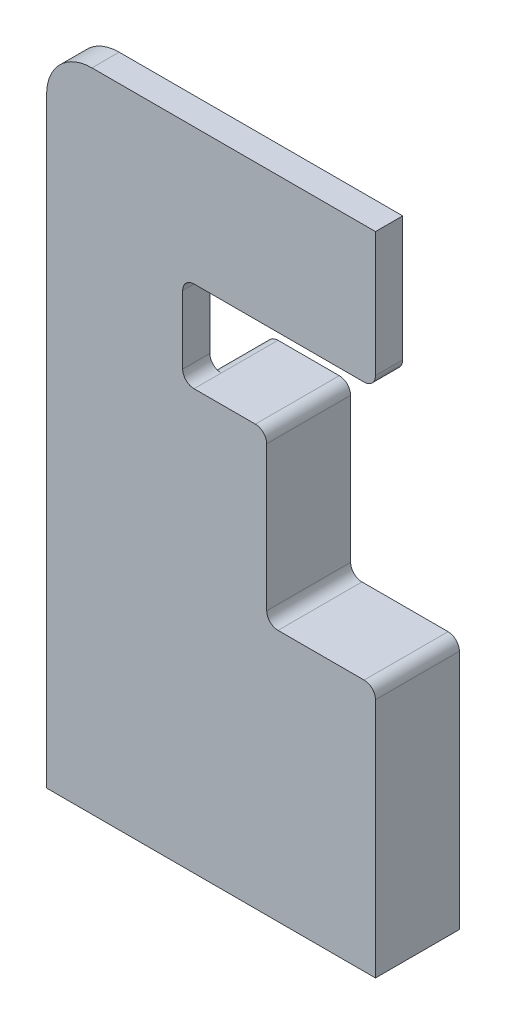
ISO-10303-21;
HEADER;
FILE_DESCRIPTION(('STEP AP214'),'2;1');
FILE_NAME('part.step','',(''),(''),'','','');
FILE_SCHEMA(('AUTOMOTIVE_DESIGN { 1 0 10303 214 1 1 1 1 }'));
ENDSEC;
DATA;
#1=APPLICATION_CONTEXT('core data for automotive mechanical design processes');
#2=APPLICATION_PROTOCOL_DEFINITION('international standard','automotive_design',2000,#1);
#3=PRODUCT_CONTEXT('',#1,'mechanical');
#4=PRODUCT('Part','Part','',(#3));
#5=PRODUCT_RELATED_PRODUCT_CATEGORY('part','',(#4));
#6=PRODUCT_DEFINITION_FORMATION('','',#4);
#7=PRODUCT_DEFINITION_CONTEXT('part definition',#1,'design');
#8=PRODUCT_DEFINITION('design','',#6,#7);
#9=PRODUCT_DEFINITION_SHAPE('','',#8);
#10=(LENGTH_UNIT() NAMED_UNIT(*) SI_UNIT(.MILLI.,.METRE.));
#11=(NAMED_UNIT(*) PLANE_ANGLE_UNIT() SI_UNIT($,.RADIAN.));
#12=(NAMED_UNIT(*) SI_UNIT($,.STERADIAN.) SOLID_ANGLE_UNIT());
#13=UNCERTAINTY_MEASURE_WITH_UNIT(LENGTH_MEASURE(1.E-05),#10,'distance_accuracy_value','');
#14=(GEOMETRIC_REPRESENTATION_CONTEXT(3) GLOBAL_UNCERTAINTY_ASSIGNED_CONTEXT((#13)) GLOBAL_UNIT_ASSIGNED_CONTEXT((#10,
#11,#12)) REPRESENTATION_CONTEXT('',''));
#15=CARTESIAN_POINT('',(0.,0.,0.));
#16=DIRECTION('',(0.,0.,1.));
#17=DIRECTION('',(1.,0.,0.));
#18=AXIS2_PLACEMENT_3D('',#15,#16,#17);
#19=CARTESIAN_POINT('',(-1.09167308680438,0.,12.));
#20=DIRECTION('',(1.,0.,0.));
#21=DIRECTION('',(0.,1.,0.));
#22=AXIS2_PLACEMENT_3D('',#19,#20,#21);
#23=PLANE('',#22);
#24=DIRECTION('',(0.,-1.,0.));
#25=VECTOR('',#24,1.);
#26=CARTESIAN_POINT('',(-1.09167308680438,0.,0.));
#27=LINE('',#26,#25);
#28=CARTESIAN_POINT('',(-1.09167308680438,13.5,0.));
#29=VERTEX_POINT('',#28);
#30=CARTESIAN_POINT('',(-1.09167308680438,0.749999999998386,0.));
#31=VERTEX_POINT('',#30);
#32=EDGE_CURVE('E317',#29,#31,#27,.T.);
#33=ORIENTED_EDGE('',*,*,#32,.F.);
#34=DIRECTION('',(0.,0.,-1.));
#35=VECTOR('',#34,1.);
#36=CARTESIAN_POINT('',(-1.09167308680438,13.5,12.));
#37=LINE('',#36,#35);
#38=CARTESIAN_POINT('',(-1.09167308680438,13.5,7.4));
#39=VERTEX_POINT('',#38);
#40=EDGE_CURVE('E230',#29,#39,#37,.F.);
#41=ORIENTED_EDGE('',*,*,#40,.T.);
#42=DIRECTION('',(0.,-1.,0.));
#43=VECTOR('',#42,1.);
#44=CARTESIAN_POINT('',(-1.09167308680438,0.,7.4));
#45=LINE('',#44,#43);
#46=CARTESIAN_POINT('',(-1.09167308680438,0.749999999998386,7.4));
#47=VERTEX_POINT('',#46);
#48=EDGE_CURVE('E326',#39,#47,#45,.T.);
#49=ORIENTED_EDGE('',*,*,#48,.T.);
#50=DIRECTION('',(0.,0.,-1.));
#51=VECTOR('',#50,1.);
#52=CARTESIAN_POINT('',(-1.09167308680438,0.749999999998386,12.));
#53=LINE('',#52,#51);
#54=EDGE_CURVE('E227',#47,#31,#53,.T.);
#55=ORIENTED_EDGE('',*,*,#54,.T.);
#56=EDGE_LOOP('',(#33,#41,#49,#55));
#57=FACE_BOUND('',#56,.T.);
#58=ADVANCED_FACE('F39',(#57),#23,.T.);
#59=CARTESIAN_POINT('',(0.,0.,0.));
#60=DIRECTION('',(0.,0.,1.));
#61=DIRECTION('',(1.,0.,0.));
#62=AXIS2_PLACEMENT_3D('',#59,#60,#61);
#63=PLANE('',#62);
#64=DIRECTION('',(1.,0.,0.));
#65=VECTOR('',#64,1.);
#66=CARTESIAN_POINT('',(-8.5,-22.5,0.));
#67=LINE('',#66,#65);
#68=CARTESIAN_POINT('',(-7.5,-22.5,0.));
#69=VERTEX_POINT('',#68);
#70=CARTESIAN_POINT('',(8.5,-22.5,0.));
#71=VERTEX_POINT('',#70);
#72=EDGE_CURVE('E205',#69,#71,#67,.T.);
#73=ORIENTED_EDGE('',*,*,#72,.F.);
#74=CARTESIAN_POINT('',(-7.5,-21.5,0.));
#75=DIRECTION('',(0.,0.,1.));
#76=DIRECTION('',(1.,0.,0.));
#77=AXIS2_PLACEMENT_3D('',#74,#75,#76);
#78=CIRCLE('',#77,1.);
#79=CARTESIAN_POINT('',(-8.5,-21.5,0.));
#80=VERTEX_POINT('',#79);
#81=EDGE_CURVE('E275',#69,#80,#78,.F.);
#82=ORIENTED_EDGE('',*,*,#81,.T.);
#83=DIRECTION('',(0.,-1.,0.));
#84=VECTOR('',#83,1.);
#85=CARTESIAN_POINT('',(-8.5,22.5,0.));
#86=LINE('',#85,#84);
#87=CARTESIAN_POINT('',(-8.5,13.5,0.));
#88=VERTEX_POINT('',#87);
#89=EDGE_CURVE('E211',#88,#80,#86,.T.);
#90=ORIENTED_EDGE('',*,*,#89,.F.);
#91=CARTESIAN_POINT('',(-7.5,13.5,0.));
#92=DIRECTION('',(0.,0.,1.));
#93=DIRECTION('',(1.,0.,0.));
#94=AXIS2_PLACEMENT_3D('',#91,#92,#93);
#95=CIRCLE('',#94,1.);
#96=CARTESIAN_POINT('',(-7.5,14.5,0.));
#97=VERTEX_POINT('',#96);
#98=EDGE_CURVE('E273',#88,#97,#95,.F.);
#99=ORIENTED_EDGE('',*,*,#98,.T.);
#100=DIRECTION('',(1.,0.,0.));
#101=VECTOR('',#100,1.);
#102=CARTESIAN_POINT('',(0.,14.5,0.));
#103=LINE('',#102,#101);
#104=CARTESIAN_POINT('',(-2.09167308680438,14.5,0.));
#105=VERTEX_POINT('',#104);
#106=EDGE_CURVE('E345',#97,#105,#103,.T.);
#107=ORIENTED_EDGE('',*,*,#106,.T.);
#108=CARTESIAN_POINT('',(-2.09167308680438,13.5,0.));
#109=DIRECTION('',(0.,0.,1.));
#110=DIRECTION('',(1.,0.,0.));
#111=AXIS2_PLACEMENT_3D('',#108,#109,#110);
#112=CIRCLE('',#111,1.);
#113=EDGE_CURVE('E225',#105,#29,#112,.F.);
#114=ORIENTED_EDGE('',*,*,#113,.T.);
#115=ORIENTED_EDGE('',*,*,#32,.T.);
#116=CARTESIAN_POINT('',(-0.0916730868043844,0.749999999998386,0.));
#117=DIRECTION('',(0.,0.,1.));
#118=DIRECTION('',(1.,0.,0.));
#119=AXIS2_PLACEMENT_3D('',#116,#117,#118);
#120=CIRCLE('',#119,1.);
#121=CARTESIAN_POINT('',(-0.0916730868043844,-0.250000000001614,0.));
#122=VERTEX_POINT('',#121);
#123=EDGE_CURVE('E259',#31,#122,#120,.T.);
#124=ORIENTED_EDGE('',*,*,#123,.T.);
#125=DIRECTION('',(-1.,0.,0.));
#126=VECTOR('',#125,1.);
#127=CARTESIAN_POINT('',(0.,-0.250000000001614,0.));
#128=LINE('',#127,#126);
#129=CARTESIAN_POINT('',(7.5,-0.250000000001614,0.));
#130=VERTEX_POINT('',#129);
#131=EDGE_CURVE('E320',#130,#122,#128,.T.);
#132=ORIENTED_EDGE('',*,*,#131,.F.);
#133=CARTESIAN_POINT('',(7.5,-1.25000000000161,0.));
#134=DIRECTION('',(0.,0.,1.));
#135=DIRECTION('',(1.,0.,0.));
#136=AXIS2_PLACEMENT_3D('',#133,#134,#135);
#137=CIRCLE('',#136,1.);
#138=CARTESIAN_POINT('',(8.5,-1.25000000000161,0.));
#139=VERTEX_POINT('',#138);
#140=EDGE_CURVE('E223',#130,#139,#137,.F.);
#141=ORIENTED_EDGE('',*,*,#140,.T.);
#142=DIRECTION('',(0.,1.,0.));
#143=VECTOR('',#142,1.);
#144=CARTESIAN_POINT('',(8.5,22.5,0.));
#145=LINE('',#144,#143);
#146=EDGE_CURVE('E296',#71,#139,#145,.T.);
#147=ORIENTED_EDGE('',*,*,#146,.F.);
#148=EDGE_LOOP('',(#73,#82,#90,#99,#107,#114,#115,#124,#132,#141,#147));
#149=FACE_BOUND('',#148,.T.);
#150=ADVANCED_FACE('F294',(#149),#63,.F.);
#151=CARTESIAN_POINT('',(-8.5,22.5,12.));
#152=DIRECTION('',(1.,0.,0.));
#153=DIRECTION('',(0.,1.,0.));
#154=AXIS2_PLACEMENT_3D('',#151,#152,#153);
#155=PLANE('',#154);
#156=ORIENTED_EDGE('',*,*,#89,.T.);
#157=DIRECTION('',(0.,0.,-1.));
#158=VECTOR('',#157,1.);
#159=CARTESIAN_POINT('',(-8.5,-21.5,12.));
#160=LINE('',#159,#158);
#161=CARTESIAN_POINT('',(-8.5,-21.5,5.));
#162=VERTEX_POINT('',#161);
#163=EDGE_CURVE('E59',#80,#162,#160,.F.);
#164=ORIENTED_EDGE('',*,*,#163,.T.);
#165=DIRECTION('',(0.,1.,0.));
#166=VECTOR('',#165,1.);
#167=CARTESIAN_POINT('',(-8.5,-22.5,5.));
#168=LINE('',#167,#166);
#169=CARTESIAN_POINT('',(-8.5,13.5,5.));
#170=VERTEX_POINT('',#169);
#171=EDGE_CURVE('E290',#162,#170,#168,.T.);
#172=ORIENTED_EDGE('',*,*,#171,.T.);
#173=DIRECTION('',(0.,0.,-1.));
#174=VECTOR('',#173,1.);
#175=CARTESIAN_POINT('',(-8.5,13.5,0.));
#176=LINE('',#175,#174);
#177=EDGE_CURVE('E277',#170,#88,#176,.T.);
#178=ORIENTED_EDGE('',*,*,#177,.T.);
#179=EDGE_LOOP('',(#156,#164,#172,#178));
#180=FACE_BOUND('',#179,.T.);
#181=ADVANCED_FACE('F390',(#180),#155,.F.);
#182=CARTESIAN_POINT('',(0.,0.,7.4));
#183=DIRECTION('',(0.,0.,1.));
#184=DIRECTION('',(1.,0.,0.));
#185=AXIS2_PLACEMENT_3D('',#182,#183,#184);
#186=PLANE('',#185);
#187=ORIENTED_EDGE('',*,*,#48,.F.);
#188=CARTESIAN_POINT('',(-2.09167308680438,13.5,7.4));
#189=DIRECTION('',(0.,0.,1.));
#190=DIRECTION('',(1.,0.,0.));
#191=AXIS2_PLACEMENT_3D('',#188,#189,#190);
#192=CIRCLE('',#191,1.);
#193=CARTESIAN_POINT('',(-2.09167308680438,14.5,7.4));
#194=VERTEX_POINT('',#193);
#195=EDGE_CURVE('E236',#39,#194,#192,.T.);
#196=ORIENTED_EDGE('',*,*,#195,.T.);
#197=DIRECTION('',(1.,0.,0.));
#198=VECTOR('',#197,1.);
#199=CARTESIAN_POINT('',(0.,14.5,7.4));
#200=LINE('',#199,#198);
#201=CARTESIAN_POINT('',(-7.5,14.5,7.4));
#202=VERTEX_POINT('',#201);
#203=EDGE_CURVE('E347',#202,#194,#200,.T.);
#204=ORIENTED_EDGE('',*,*,#203,.F.);
#205=CARTESIAN_POINT('',(-7.5,15.5,7.4));
#206=DIRECTION('',(0.,0.,1.));
#207=DIRECTION('',(1.,0.,0.));
#208=AXIS2_PLACEMENT_3D('',#205,#206,#207);
#209=CIRCLE('',#208,1.);
#210=CARTESIAN_POINT('',(-8.5,15.5,7.4));
#211=VERTEX_POINT('',#210);
#212=EDGE_CURVE('E269',#202,#211,#209,.F.);
#213=ORIENTED_EDGE('',*,*,#212,.T.);
#214=DIRECTION('',(0.,1.,0.));
#215=VECTOR('',#214,1.);
#216=CARTESIAN_POINT('',(-8.5,0.,7.4));
#217=LINE('',#216,#215);
#218=CARTESIAN_POINT('',(-8.5,21.5,7.4));
#219=VERTEX_POINT('',#218);
#220=EDGE_CURVE('E344',#211,#219,#217,.T.);
#221=ORIENTED_EDGE('',*,*,#220,.T.);
#222=CARTESIAN_POINT('',(-7.5,21.5,7.4));
#223=DIRECTION('',(0.,0.,1.));
#224=DIRECTION('',(1.,0.,0.));
#225=AXIS2_PLACEMENT_3D('',#222,#223,#224);
#226=CIRCLE('',#225,1.);
#227=CARTESIAN_POINT('',(-7.5,22.5,7.4));
#228=VERTEX_POINT('',#227);
#229=EDGE_CURVE('E265',#219,#228,#226,.F.);
#230=ORIENTED_EDGE('',*,*,#229,.T.);
#231=DIRECTION('',(-1.,0.,0.));
#232=VECTOR('',#231,1.);
#233=CARTESIAN_POINT('',(0.,22.5,7.4));
#234=LINE('',#233,#232);
#235=CARTESIAN_POINT('',(7.5,22.5,7.4));
#236=VERTEX_POINT('',#235);
#237=EDGE_CURVE('E323',#236,#228,#234,.T.);
#238=ORIENTED_EDGE('',*,*,#237,.F.);
#239=CARTESIAN_POINT('',(7.5,23.5,7.4));
#240=DIRECTION('',(0.,0.,1.));
#241=DIRECTION('',(1.,0.,0.));
#242=AXIS2_PLACEMENT_3D('',#239,#240,#241);
#243=CIRCLE('',#242,1.);
#244=CARTESIAN_POINT('',(8.5,23.5,7.4));
#245=VERTEX_POINT('',#244);
#246=EDGE_CURVE('E232',#236,#245,#243,.T.);
#247=ORIENTED_EDGE('',*,*,#246,.T.);
#248=DIRECTION('',(0.,-1.,0.));
#249=VECTOR('',#248,1.);
#250=CARTESIAN_POINT('',(8.5,0.,7.4));
#251=LINE('',#250,#249);
#252=CARTESIAN_POINT('',(8.49999999999999,34.5,7.4));
#253=VERTEX_POINT('',#252);
#254=EDGE_CURVE('E338',#253,#245,#251,.T.);
#255=ORIENTED_EDGE('',*,*,#254,.F.);
#256=DIRECTION('',(1.,0.,0.));
#257=VECTOR('',#256,1.);
#258=CARTESIAN_POINT('',(0.,34.5,7.4));
#259=LINE('',#258,#257);
#260=CARTESIAN_POINT('',(-16.5,34.5,7.4));
#261=VERTEX_POINT('',#260);
#262=EDGE_CURVE('E335',#261,#253,#259,.T.);
#263=ORIENTED_EDGE('',*,*,#262,.F.);
#264=CARTESIAN_POINT('',(-16.5,30.5,7.4));
#265=DIRECTION('',(0.,0.,1.));
#266=DIRECTION('',(1.,0.,0.));
#267=AXIS2_PLACEMENT_3D('',#264,#265,#266);
#268=CIRCLE('',#267,4.);
#269=CARTESIAN_POINT('',(-20.5,30.5,7.4));
#270=VERTEX_POINT('',#269);
#271=EDGE_CURVE('E332',#270,#261,#268,.F.);
#272=ORIENTED_EDGE('',*,*,#271,.F.);
#273=DIRECTION('',(0.,1.,0.));
#274=VECTOR('',#273,1.);
#275=CARTESIAN_POINT('',(-20.5,0.,7.4));
#276=LINE('',#275,#274);
#277=CARTESIAN_POINT('',(-20.5,-22.5,7.4));
#278=VERTEX_POINT('',#277);
#279=EDGE_CURVE('E197',#278,#270,#276,.T.);
#280=ORIENTED_EDGE('',*,*,#279,.F.);
#281=DIRECTION('',(-1.,0.,0.));
#282=VECTOR('',#281,1.);
#283=CARTESIAN_POINT('',(0.,-22.5,7.4));
#284=LINE('',#283,#282);
#285=CARTESIAN_POINT('',(8.5,-22.5,7.4));
#286=VERTEX_POINT('',#285);
#287=EDGE_CURVE('E191',#286,#278,#284,.T.);
#288=ORIENTED_EDGE('',*,*,#287,.F.);
#289=DIRECTION('',(0.,-1.,0.));
#290=VECTOR('',#289,1.);
#291=CARTESIAN_POINT('',(8.5,0.,7.4));
#292=LINE('',#291,#290);
#293=CARTESIAN_POINT('',(8.5,-1.25000000000161,7.4));
#294=VERTEX_POINT('',#293);
#295=EDGE_CURVE('E179',#294,#286,#292,.T.);
#296=ORIENTED_EDGE('',*,*,#295,.F.);
#297=CARTESIAN_POINT('',(7.5,-1.25000000000161,7.4));
#298=DIRECTION('',(0.,0.,1.));
#299=DIRECTION('',(1.,0.,0.));
#300=AXIS2_PLACEMENT_3D('',#297,#298,#299);
#301=CIRCLE('',#300,1.);
#302=CARTESIAN_POINT('',(7.5,-0.250000000001614,7.4));
#303=VERTEX_POINT('',#302);
#304=EDGE_CURVE('E234',#294,#303,#301,.T.);
#305=ORIENTED_EDGE('',*,*,#304,.T.);
#306=DIRECTION('',(1.,0.,0.));
#307=VECTOR('',#306,1.);
#308=CARTESIAN_POINT('',(0.,-0.250000000001614,7.4));
#309=LINE('',#308,#307);
#310=CARTESIAN_POINT('',(-0.0916730868043844,-0.250000000001614,7.4));
#311=VERTEX_POINT('',#310);
#312=EDGE_CURVE('E190',#311,#303,#309,.T.);
#313=ORIENTED_EDGE('',*,*,#312,.F.);
#314=CARTESIAN_POINT('',(-0.0916730868043844,0.749999999998386,7.4));
#315=DIRECTION('',(0.,0.,1.));
#316=DIRECTION('',(1.,0.,0.));
#317=AXIS2_PLACEMENT_3D('',#314,#315,#316);
#318=CIRCLE('',#317,1.);
#319=EDGE_CURVE('E261',#311,#47,#318,.F.);
#320=ORIENTED_EDGE('',*,*,#319,.T.);
#321=EDGE_LOOP('',(#187,#196,#204,#213,#221,#230,#238,#247,#255,#263,#272,#280,#288,#296,#305,
#313,#320));
#322=FACE_BOUND('',#321,.T.);
#323=ADVANCED_FACE('F195',(#322),#186,.T.);
#324=CARTESIAN_POINT('',(8.5,22.5,12.));
#325=DIRECTION('',(-1.,0.,0.));
#326=DIRECTION('',(0.,-1.,0.));
#327=AXIS2_PLACEMENT_3D('',#324,#325,#326);
#328=PLANE('',#327);
#329=ORIENTED_EDGE('',*,*,#254,.T.);
#330=DIRECTION('',(0.,0.,-1.));
#331=VECTOR('',#330,1.);
#332=CARTESIAN_POINT('',(8.5,23.5,12.));
#333=LINE('',#332,#331);
#334=CARTESIAN_POINT('',(8.5,23.5,5.));
#335=VERTEX_POINT('',#334);
#336=EDGE_CURVE('E244',#245,#335,#333,.T.);
#337=ORIENTED_EDGE('',*,*,#336,.T.);
#338=DIRECTION('',(0.,1.,0.));
#339=VECTOR('',#338,1.);
#340=CARTESIAN_POINT('',(8.5,22.5,5.));
#341=LINE('',#340,#339);
#342=CARTESIAN_POINT('',(8.5,34.5,5.));
#343=VERTEX_POINT('',#342);
#344=EDGE_CURVE('E310',#335,#343,#341,.T.);
#345=ORIENTED_EDGE('',*,*,#344,.T.);
#346=DIRECTION('',(0.,0.,1.));
#347=VECTOR('',#346,1.);
#348=CARTESIAN_POINT('',(8.5,34.5,5.));
#349=LINE('',#348,#347);
#350=EDGE_CURVE('E300',#343,#253,#349,.T.);
#351=ORIENTED_EDGE('',*,*,#350,.T.);
#352=EDGE_LOOP('',(#329,#337,#345,#351));
#353=FACE_BOUND('',#352,.T.);
#354=ADVANCED_FACE('F414',(#353),#328,.F.);
#355=ORIENTED_EDGE('',*,*,#146,.T.);
#356=DIRECTION('',(0.,0.,-1.));
#357=VECTOR('',#356,1.);
#358=CARTESIAN_POINT('',(8.5,-1.25000000000161,12.));
#359=LINE('',#358,#357);
#360=EDGE_CURVE('E187',#139,#294,#359,.F.);
#361=ORIENTED_EDGE('',*,*,#360,.T.);
#362=ORIENTED_EDGE('',*,*,#295,.T.);
#363=DIRECTION('',(0.,0.,-1.));
#364=VECTOR('',#363,1.);
#365=CARTESIAN_POINT('',(8.5,-22.5,12.));
#366=LINE('',#365,#364);
#367=EDGE_CURVE('E184',#286,#71,#366,.T.);
#368=ORIENTED_EDGE('',*,*,#367,.T.);
#369=EDGE_LOOP('',(#355,#361,#362,#368));
#370=FACE_BOUND('',#369,.T.);
#371=ADVANCED_FACE('F182',(#370),#328,.F.);
#372=CARTESIAN_POINT('',(-8.5,-22.5,12.));
#373=DIRECTION('',(0.,1.,0.));
#374=DIRECTION('',(0.,0.,1.));
#375=AXIS2_PLACEMENT_3D('',#372,#373,#374);
#376=PLANE('',#375);
#377=DIRECTION('',(1.,0.,0.));
#378=VECTOR('',#377,1.);
#379=CARTESIAN_POINT('',(-20.5,-22.5,5.));
#380=LINE('',#379,#378);
#381=CARTESIAN_POINT('',(-20.5,-22.5,5.));
#382=VERTEX_POINT('',#381);
#383=CARTESIAN_POINT('',(-7.5,-22.5,5.));
#384=VERTEX_POINT('',#383);
#385=EDGE_CURVE('E289',#382,#384,#380,.T.);
#386=ORIENTED_EDGE('',*,*,#385,.T.);
#387=DIRECTION('',(0.,0.,-1.));
#388=VECTOR('',#387,1.);
#389=CARTESIAN_POINT('',(-7.5,-22.5,12.));
#390=LINE('',#389,#388);
#391=EDGE_CURVE('E271',#384,#69,#390,.T.);
#392=ORIENTED_EDGE('',*,*,#391,.T.);
#393=ORIENTED_EDGE('',*,*,#72,.T.);
#394=ORIENTED_EDGE('',*,*,#367,.F.);
#395=ORIENTED_EDGE('',*,*,#287,.T.);
#396=DIRECTION('',(0.,0.,1.));
#397=VECTOR('',#396,1.);
#398=CARTESIAN_POINT('',(-20.5,-22.5,5.));
#399=LINE('',#398,#397);
#400=EDGE_CURVE('E298',#382,#278,#399,.T.);
#401=ORIENTED_EDGE('',*,*,#400,.F.);
#402=EDGE_LOOP('',(#386,#392,#393,#394,#395,#401));
#403=FACE_BOUND('',#402,.T.);
#404=ADVANCED_FACE('F202',(#403),#376,.F.);
#405=CARTESIAN_POINT('',(-20.5,34.5,5.));
#406=DIRECTION('',(-1.,0.,0.));
#407=DIRECTION('',(0.,-1.,0.));
#408=AXIS2_PLACEMENT_3D('',#405,#406,#407);
#409=PLANE('',#408);
#410=ORIENTED_EDGE('',*,*,#400,.T.);
#411=ORIENTED_EDGE('',*,*,#279,.T.);
#412=DIRECTION('',(0.,0.,1.));
#413=VECTOR('',#412,1.);
#414=CARTESIAN_POINT('',(-20.5,30.5,5.));
#415=LINE('',#414,#413);
#416=CARTESIAN_POINT('',(-20.5,30.5,5.));
#417=VERTEX_POINT('',#416);
#418=EDGE_CURVE('E209',#270,#417,#415,.F.);
#419=ORIENTED_EDGE('',*,*,#418,.T.);
#420=DIRECTION('',(0.,-1.,0.));
#421=VECTOR('',#420,1.);
#422=CARTESIAN_POINT('',(-20.5,34.5,5.));
#423=LINE('',#422,#421);
#424=EDGE_CURVE('E304',#417,#382,#423,.T.);
#425=ORIENTED_EDGE('',*,*,#424,.T.);
#426=EDGE_LOOP('',(#410,#411,#419,#425));
#427=FACE_BOUND('',#426,.T.);
#428=ADVANCED_FACE('F401',(#427),#409,.T.);
#429=CARTESIAN_POINT('',(8.5,34.5,5.));
#430=DIRECTION('',(0.,1.,0.));
#431=DIRECTION('',(-1.,0.,0.));
#432=AXIS2_PLACEMENT_3D('',#429,#430,#431);
#433=PLANE('',#432);
#434=DIRECTION('',(0.,0.,1.));
#435=VECTOR('',#434,1.);
#436=CARTESIAN_POINT('',(-16.5,34.5,5.));
#437=LINE('',#436,#435);
#438=CARTESIAN_POINT('',(-16.5,34.5,5.));
#439=VERTEX_POINT('',#438);
#440=EDGE_CURVE('E206',#439,#261,#437,.T.);
#441=ORIENTED_EDGE('',*,*,#440,.T.);
#442=ORIENTED_EDGE('',*,*,#262,.T.);
#443=ORIENTED_EDGE('',*,*,#350,.F.);
#444=DIRECTION('',(-1.,0.,0.));
#445=VECTOR('',#444,1.);
#446=CARTESIAN_POINT('',(8.5,34.5,5.));
#447=LINE('',#446,#445);
#448=EDGE_CURVE('E307',#343,#439,#447,.T.);
#449=ORIENTED_EDGE('',*,*,#448,.T.);
#450=EDGE_LOOP('',(#441,#442,#443,#449));
#451=FACE_BOUND('',#450,.T.);
#452=ADVANCED_FACE('F404',(#451),#433,.T.);
#453=CARTESIAN_POINT('',(-16.5,30.5,5.));
#454=DIRECTION('',(0.,0.,1.));
#455=DIRECTION('',(1.,0.,0.));
#456=AXIS2_PLACEMENT_3D('',#453,#454,#455);
#457=CYLINDRICAL_SURFACE('',#456,4.);
#458=ORIENTED_EDGE('',*,*,#418,.F.);
#459=ORIENTED_EDGE('',*,*,#271,.T.);
#460=ORIENTED_EDGE('',*,*,#440,.F.);
#461=CARTESIAN_POINT('',(-16.5,30.5,5.));
#462=DIRECTION('',(0.,0.,1.));
#463=DIRECTION('',(1.,0.,0.));
#464=AXIS2_PLACEMENT_3D('',#461,#462,#463);
#465=CIRCLE('',#464,4.);
#466=EDGE_CURVE('E216',#417,#439,#465,.F.);
#467=ORIENTED_EDGE('',*,*,#466,.F.);
#468=EDGE_LOOP('',(#458,#459,#460,#467));
#469=FACE_BOUND('',#468,.T.);
#470=ADVANCED_FACE('F407',(#469),#457,.T.);
#471=CARTESIAN_POINT('',(0.,22.5,12.));
#472=DIRECTION('',(0.,1.,0.));
#473=DIRECTION('',(0.,0.,1.));
#474=AXIS2_PLACEMENT_3D('',#471,#472,#473);
#475=PLANE('',#474);
#476=DIRECTION('',(1.,0.,0.));
#477=VECTOR('',#476,1.);
#478=CARTESIAN_POINT('',(-8.5,22.5,5.));
#479=LINE('',#478,#477);
#480=CARTESIAN_POINT('',(-7.5,22.5,5.));
#481=VERTEX_POINT('',#480);
#482=CARTESIAN_POINT('',(7.5,22.5,5.));
#483=VERTEX_POINT('',#482);
#484=EDGE_CURVE('E312',#481,#483,#479,.T.);
#485=ORIENTED_EDGE('',*,*,#484,.T.);
#486=DIRECTION('',(0.,0.,-1.));
#487=VECTOR('',#486,1.);
#488=CARTESIAN_POINT('',(7.5,22.5,12.));
#489=LINE('',#488,#487);
#490=EDGE_CURVE('E252',#483,#236,#489,.F.);
#491=ORIENTED_EDGE('',*,*,#490,.T.);
#492=ORIENTED_EDGE('',*,*,#237,.T.);
#493=DIRECTION('',(0.,0.,-1.));
#494=VECTOR('',#493,1.);
#495=CARTESIAN_POINT('',(-7.5,22.5,5.));
#496=LINE('',#495,#494);
#497=EDGE_CURVE('E249',#228,#481,#496,.T.);
#498=ORIENTED_EDGE('',*,*,#497,.T.);
#499=EDGE_LOOP('',(#485,#491,#492,#498));
#500=FACE_BOUND('',#499,.T.);
#501=ADVANCED_FACE('F394',(#500),#475,.F.);
#502=CARTESIAN_POINT('',(0.,-0.250000000001614,12.));
#503=DIRECTION('',(0.,-1.,0.));
#504=DIRECTION('',(1.,0.,0.));
#505=AXIS2_PLACEMENT_3D('',#502,#503,#504);
#506=PLANE('',#505);
#507=ORIENTED_EDGE('',*,*,#312,.T.);
#508=DIRECTION('',(0.,0.,-1.));
#509=VECTOR('',#508,1.);
#510=CARTESIAN_POINT('',(7.5,-0.250000000001614,12.));
#511=LINE('',#510,#509);
#512=EDGE_CURVE('E240',#303,#130,#511,.T.);
#513=ORIENTED_EDGE('',*,*,#512,.T.);
#514=ORIENTED_EDGE('',*,*,#131,.T.);
#515=DIRECTION('',(0.,0.,-1.));
#516=VECTOR('',#515,1.);
#517=CARTESIAN_POINT('',(-0.0916730868043844,-0.250000000001614,12.));
#518=LINE('',#517,#516);
#519=EDGE_CURVE('E238',#122,#311,#518,.F.);
#520=ORIENTED_EDGE('',*,*,#519,.T.);
#521=EDGE_LOOP('',(#507,#513,#514,#520));
#522=FACE_BOUND('',#521,.T.);
#523=ADVANCED_FACE('F371',(#522),#506,.F.);
#524=CARTESIAN_POINT('',(0.,0.,5.));
#525=DIRECTION('',(0.,0.,1.));
#526=DIRECTION('',(1.,0.,0.));
#527=AXIS2_PLACEMENT_3D('',#524,#525,#526);
#528=PLANE('',#527);
#529=ORIENTED_EDGE('',*,*,#344,.F.);
#530=CARTESIAN_POINT('',(7.5,23.5,5.));
#531=DIRECTION('',(0.,0.,1.));
#532=DIRECTION('',(1.,0.,0.));
#533=AXIS2_PLACEMENT_3D('',#530,#531,#532);
#534=CIRCLE('',#533,1.);
#535=EDGE_CURVE('E247',#335,#483,#534,.F.);
#536=ORIENTED_EDGE('',*,*,#535,.T.);
#537=ORIENTED_EDGE('',*,*,#484,.F.);
#538=CARTESIAN_POINT('',(-7.5,21.5,5.));
#539=DIRECTION('',(0.,0.,1.));
#540=DIRECTION('',(1.,0.,0.));
#541=AXIS2_PLACEMENT_3D('',#538,#539,#540);
#542=CIRCLE('',#541,1.);
#543=CARTESIAN_POINT('',(-8.5,21.5,5.));
#544=VERTEX_POINT('',#543);
#545=EDGE_CURVE('E263',#481,#544,#542,.T.);
#546=ORIENTED_EDGE('',*,*,#545,.T.);
#547=DIRECTION('',(0.,-1.,0.));
#548=VECTOR('',#547,1.);
#549=CARTESIAN_POINT('',(-8.5,0.,5.));
#550=LINE('',#549,#548);
#551=CARTESIAN_POINT('',(-8.5,15.5,5.));
#552=VERTEX_POINT('',#551);
#553=EDGE_CURVE('E341',#544,#552,#550,.T.);
#554=ORIENTED_EDGE('',*,*,#553,.T.);
#555=CARTESIAN_POINT('',(-7.5,15.5,5.));
#556=DIRECTION('',(0.,0.,1.));
#557=DIRECTION('',(1.,0.,0.));
#558=AXIS2_PLACEMENT_3D('',#555,#556,#557);
#559=CIRCLE('',#558,1.);
#560=CARTESIAN_POINT('',(-7.5,14.5,5.));
#561=VERTEX_POINT('',#560);
#562=EDGE_CURVE('E267',#552,#561,#559,.T.);
#563=ORIENTED_EDGE('',*,*,#562,.T.);
#564=CARTESIAN_POINT('',(-7.5,13.5,5.));
#565=DIRECTION('',(0.,0.,1.));
#566=DIRECTION('',(1.,0.,0.));
#567=AXIS2_PLACEMENT_3D('',#564,#565,#566);
#568=CIRCLE('',#567,1.);
#569=EDGE_CURVE('E12',#561,#170,#568,.T.);
#570=ORIENTED_EDGE('',*,*,#569,.T.);
#571=ORIENTED_EDGE('',*,*,#171,.F.);
#572=CARTESIAN_POINT('',(-7.5,-21.5,5.));
#573=DIRECTION('',(0.,0.,1.));
#574=DIRECTION('',(1.,0.,0.));
#575=AXIS2_PLACEMENT_3D('',#572,#573,#574);
#576=CIRCLE('',#575,1.);
#577=EDGE_CURVE('E47',#162,#384,#576,.T.);
#578=ORIENTED_EDGE('',*,*,#577,.T.);
#579=ORIENTED_EDGE('',*,*,#385,.F.);
#580=ORIENTED_EDGE('',*,*,#424,.F.);
#581=ORIENTED_EDGE('',*,*,#466,.T.);
#582=ORIENTED_EDGE('',*,*,#448,.F.);
#583=EDGE_LOOP('',(#529,#536,#537,#546,#554,#563,#570,#571,#578,#579,#580,#581,#582));
#584=FACE_BOUND('',#583,.T.);
#585=ADVANCED_FACE('F287',(#584),#528,.F.);
#586=CARTESIAN_POINT('',(-8.5,0.,7.4));
#587=DIRECTION('',(-1.,0.,0.));
#588=DIRECTION('',(0.,-1.,0.));
#589=AXIS2_PLACEMENT_3D('',#586,#587,#588);
#590=PLANE('',#589);
#591=ORIENTED_EDGE('',*,*,#553,.F.);
#592=DIRECTION('',(0.,0.,-1.));
#593=VECTOR('',#592,1.);
#594=CARTESIAN_POINT('',(-8.5,21.5,7.4));
#595=LINE('',#594,#593);
#596=EDGE_CURVE('E257',#544,#219,#595,.F.);
#597=ORIENTED_EDGE('',*,*,#596,.T.);
#598=ORIENTED_EDGE('',*,*,#220,.F.);
#599=DIRECTION('',(0.,0.,-1.));
#600=VECTOR('',#599,1.);
#601=CARTESIAN_POINT('',(-8.5,15.5,7.4));
#602=LINE('',#601,#600);
#603=EDGE_CURVE('E254',#211,#552,#602,.T.);
#604=ORIENTED_EDGE('',*,*,#603,.T.);
#605=EDGE_LOOP('',(#591,#597,#598,#604));
#606=FACE_BOUND('',#605,.T.);
#607=ADVANCED_FACE('F400',(#606),#590,.F.);
#608=CARTESIAN_POINT('',(0.,14.5,7.4));
#609=DIRECTION('',(0.,1.,0.));
#610=DIRECTION('',(0.,0.,1.));
#611=AXIS2_PLACEMENT_3D('',#608,#609,#610);
#612=PLANE('',#611);
#613=ORIENTED_EDGE('',*,*,#106,.F.);
#614=DIRECTION('',(0.,0.,-1.));
#615=VECTOR('',#614,1.);
#616=CARTESIAN_POINT('',(-7.5,14.5,5.));
#617=LINE('',#616,#615);
#618=EDGE_CURVE('E281',#97,#561,#617,.F.);
#619=ORIENTED_EDGE('',*,*,#618,.T.);
#620=DIRECTION('',(0.,0.,-1.));
#621=VECTOR('',#620,1.);
#622=CARTESIAN_POINT('',(-7.5,14.5,7.4));
#623=LINE('',#622,#621);
#624=EDGE_CURVE('E218',#561,#202,#623,.F.);
#625=ORIENTED_EDGE('',*,*,#624,.T.);
#626=ORIENTED_EDGE('',*,*,#203,.T.);
#627=DIRECTION('',(0.,0.,-1.));
#628=VECTOR('',#627,1.);
#629=CARTESIAN_POINT('',(-2.09167308680438,14.5,7.4));
#630=LINE('',#629,#628);
#631=EDGE_CURVE('E220',#194,#105,#630,.T.);
#632=ORIENTED_EDGE('',*,*,#631,.T.);
#633=EDGE_LOOP('',(#613,#619,#625,#626,#632));
#634=FACE_BOUND('',#633,.T.);
#635=ADVANCED_FACE('F355',(#634),#612,.T.);
#636=CARTESIAN_POINT('',(-2.09167308680438,13.5,7.4));
#637=DIRECTION('',(0.,0.,-1.));
#638=DIRECTION('',(-1.,0.,0.));
#639=AXIS2_PLACEMENT_3D('',#636,#637,#638);
#640=CYLINDRICAL_SURFACE('',#639,1.);
#641=ORIENTED_EDGE('',*,*,#195,.F.);
#642=ORIENTED_EDGE('',*,*,#40,.F.);
#643=ORIENTED_EDGE('',*,*,#113,.F.);
#644=ORIENTED_EDGE('',*,*,#631,.F.);
#645=EDGE_LOOP('',(#641,#642,#643,#644));
#646=FACE_BOUND('',#645,.T.);
#647=ADVANCED_FACE('F361',(#646),#640,.T.);
#648=CARTESIAN_POINT('',(7.5,-1.25000000000161,12.));
#649=DIRECTION('',(0.,0.,-1.));
#650=DIRECTION('',(-1.,0.,0.));
#651=AXIS2_PLACEMENT_3D('',#648,#649,#650);
#652=CYLINDRICAL_SURFACE('',#651,1.);
#653=ORIENTED_EDGE('',*,*,#304,.F.);
#654=ORIENTED_EDGE('',*,*,#360,.F.);
#655=ORIENTED_EDGE('',*,*,#140,.F.);
#656=ORIENTED_EDGE('',*,*,#512,.F.);
#657=EDGE_LOOP('',(#653,#654,#655,#656));
#658=FACE_BOUND('',#657,.T.);
#659=ADVANCED_FACE('F375',(#658),#652,.T.);
#660=CARTESIAN_POINT('',(-0.0916730868043844,0.749999999998386,12.));
#661=DIRECTION('',(0.,0.,-1.));
#662=DIRECTION('',(-1.,0.,0.));
#663=AXIS2_PLACEMENT_3D('',#660,#661,#662);
#664=CYLINDRICAL_SURFACE('',#663,1.);
#665=ORIENTED_EDGE('',*,*,#319,.F.);
#666=ORIENTED_EDGE('',*,*,#519,.F.);
#667=ORIENTED_EDGE('',*,*,#123,.F.);
#668=ORIENTED_EDGE('',*,*,#54,.F.);
#669=EDGE_LOOP('',(#665,#666,#667,#668));
#670=FACE_BOUND('',#669,.T.);
#671=ADVANCED_FACE('F368',(#670),#664,.F.);
#672=CARTESIAN_POINT('',(7.5,23.5,12.));
#673=DIRECTION('',(0.,0.,-1.));
#674=DIRECTION('',(-1.,0.,0.));
#675=AXIS2_PLACEMENT_3D('',#672,#673,#674);
#676=CYLINDRICAL_SURFACE('',#675,1.);
#677=ORIENTED_EDGE('',*,*,#246,.F.);
#678=ORIENTED_EDGE('',*,*,#490,.F.);
#679=ORIENTED_EDGE('',*,*,#535,.F.);
#680=ORIENTED_EDGE('',*,*,#336,.F.);
#681=EDGE_LOOP('',(#677,#678,#679,#680));
#682=FACE_BOUND('',#681,.T.);
#683=ADVANCED_FACE('F382',(#682),#676,.T.);
#684=CARTESIAN_POINT('',(-7.5,21.5,12.));
#685=DIRECTION('',(0.,0.,1.));
#686=DIRECTION('',(1.,0.,0.));
#687=AXIS2_PLACEMENT_3D('',#684,#685,#686);
#688=CYLINDRICAL_SURFACE('',#687,1.);
#689=ORIENTED_EDGE('',*,*,#229,.F.);
#690=ORIENTED_EDGE('',*,*,#596,.F.);
#691=ORIENTED_EDGE('',*,*,#545,.F.);
#692=ORIENTED_EDGE('',*,*,#497,.F.);
#693=EDGE_LOOP('',(#689,#690,#691,#692));
#694=FACE_BOUND('',#693,.T.);
#695=ADVANCED_FACE('F438',(#694),#688,.F.);
#696=CARTESIAN_POINT('',(-7.5,15.5,7.4));
#697=DIRECTION('',(0.,0.,-1.));
#698=DIRECTION('',(-1.,0.,0.));
#699=AXIS2_PLACEMENT_3D('',#696,#697,#698);
#700=CYLINDRICAL_SURFACE('',#699,1.);
#701=ORIENTED_EDGE('',*,*,#212,.F.);
#702=ORIENTED_EDGE('',*,*,#624,.F.);
#703=ORIENTED_EDGE('',*,*,#562,.F.);
#704=ORIENTED_EDGE('',*,*,#603,.F.);
#705=EDGE_LOOP('',(#701,#702,#703,#704));
#706=FACE_BOUND('',#705,.T.);
#707=ADVANCED_FACE('F445',(#706),#700,.F.);
#708=CARTESIAN_POINT('',(-7.5,-21.5,12.));
#709=DIRECTION('',(0.,0.,-1.));
#710=DIRECTION('',(-1.,0.,0.));
#711=AXIS2_PLACEMENT_3D('',#708,#709,#710);
#712=CYLINDRICAL_SURFACE('',#711,1.);
#713=ORIENTED_EDGE('',*,*,#577,.F.);
#714=ORIENTED_EDGE('',*,*,#163,.F.);
#715=ORIENTED_EDGE('',*,*,#81,.F.);
#716=ORIENTED_EDGE('',*,*,#391,.F.);
#717=EDGE_LOOP('',(#713,#714,#715,#716));
#718=FACE_BOUND('',#717,.T.);
#719=ADVANCED_FACE('F292',(#718),#712,.T.);
#720=CARTESIAN_POINT('',(-7.5,13.5,12.));
#721=DIRECTION('',(0.,0.,1.));
#722=DIRECTION('',(1.,0.,0.));
#723=AXIS2_PLACEMENT_3D('',#720,#721,#722);
#724=CYLINDRICAL_SURFACE('',#723,1.);
#725=ORIENTED_EDGE('',*,*,#569,.F.);
#726=ORIENTED_EDGE('',*,*,#618,.F.);
#727=ORIENTED_EDGE('',*,*,#98,.F.);
#728=ORIENTED_EDGE('',*,*,#177,.F.);
#729=EDGE_LOOP('',(#725,#726,#727,#728));
#730=FACE_BOUND('',#729,.T.);
#731=ADVANCED_FACE('F41',(#730),#724,.T.);
#732=CLOSED_SHELL('',(#58,#150,#181,#323,#354,#371,#404,#428,#452,#470,#501,#523,#585,#607,#635,
#647,#659,#671,#683,#695,#707,#719,#731));
#733=MANIFOLD_SOLID_BREP('B2',#732);
#734=ADVANCED_BREP_SHAPE_REPRESENTATION('',(#18,#733),#14);
#735=SHAPE_DEFINITION_REPRESENTATION(#9,#734);
ENDSEC;
END-ISO-10303-21;
